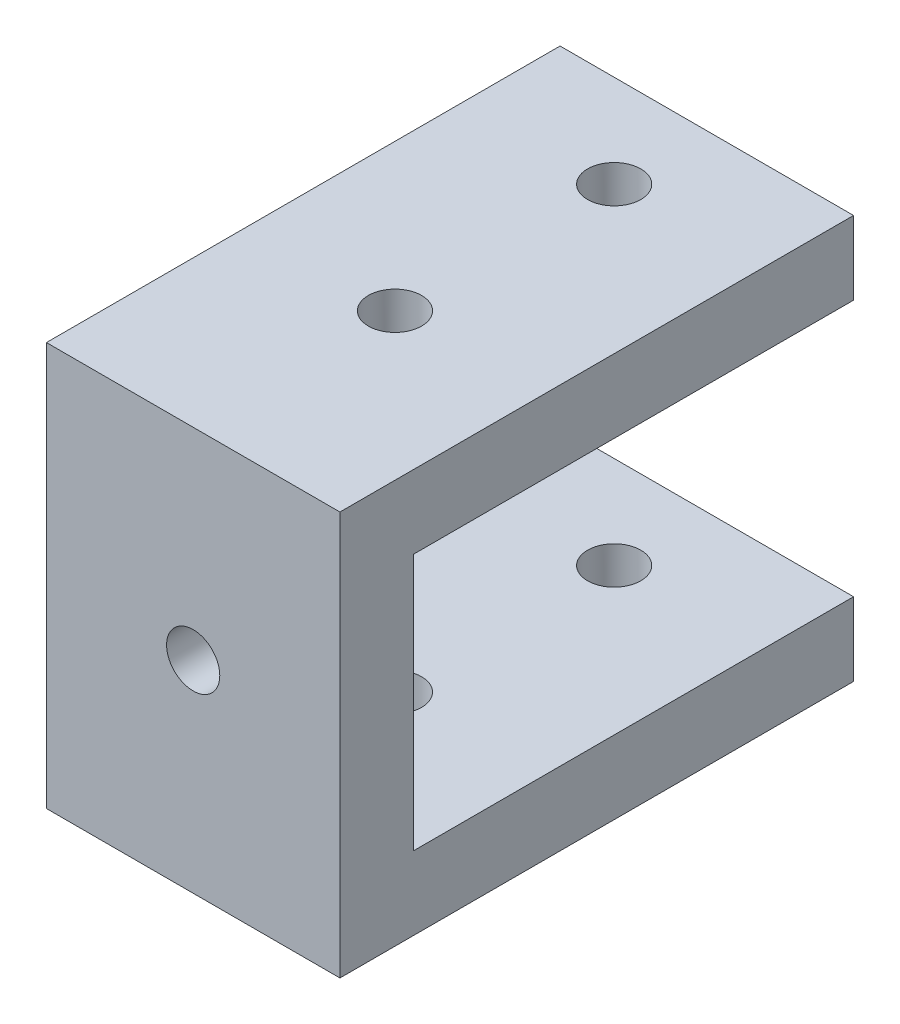
ISO-10303-21;
HEADER;
FILE_DESCRIPTION(('STEP AP214'),'2;1');
FILE_NAME('part.step','',(''),(''),'','','');
FILE_SCHEMA(('AUTOMOTIVE_DESIGN { 1 0 10303 214 1 1 1 1 }'));
ENDSEC;
DATA;
#1=APPLICATION_CONTEXT('core data for automotive mechanical design processes');
#2=APPLICATION_PROTOCOL_DEFINITION('international standard','automotive_design',2000,#1);
#3=PRODUCT_CONTEXT('',#1,'mechanical');
#4=PRODUCT('Part','Part','',(#3));
#5=PRODUCT_RELATED_PRODUCT_CATEGORY('part','',(#4));
#6=PRODUCT_DEFINITION_FORMATION('','',#4);
#7=PRODUCT_DEFINITION_CONTEXT('part definition',#1,'design');
#8=PRODUCT_DEFINITION('design','',#6,#7);
#9=PRODUCT_DEFINITION_SHAPE('','',#8);
#10=(LENGTH_UNIT() NAMED_UNIT(*) SI_UNIT(.MILLI.,.METRE.));
#11=(NAMED_UNIT(*) PLANE_ANGLE_UNIT() SI_UNIT($,.RADIAN.));
#12=(NAMED_UNIT(*) SI_UNIT($,.STERADIAN.) SOLID_ANGLE_UNIT());
#13=UNCERTAINTY_MEASURE_WITH_UNIT(LENGTH_MEASURE(1.E-05),#10,'distance_accuracy_value','');
#14=(GEOMETRIC_REPRESENTATION_CONTEXT(3) GLOBAL_UNCERTAINTY_ASSIGNED_CONTEXT((#13)) GLOBAL_UNIT_ASSIGNED_CONTEXT((#10,
#11,#12)) REPRESENTATION_CONTEXT('',''));
#15=CARTESIAN_POINT('',(0.,0.,0.));
#16=DIRECTION('',(0.,0.,1.));
#17=DIRECTION('',(1.,0.,0.));
#18=AXIS2_PLACEMENT_3D('',#15,#16,#17);
#19=CARTESIAN_POINT('',(20.32,8.89000000000001,-30.48));
#20=DIRECTION('',(0.,1.,0.));
#21=DIRECTION('',(0.,0.,1.));
#22=AXIS2_PLACEMENT_3D('',#19,#20,#21);
#23=PLANE('',#22);
#24=CARTESIAN_POINT('',(10.16,8.89000000000001,-8.89));
#25=DIRECTION('',(0.,1.,0.));
#26=DIRECTION('',(0.,0.,1.));
#27=AXIS2_PLACEMENT_3D('',#24,#25,#26);
#28=CIRCLE('',#27,1.8415);
#29=CARTESIAN_POINT('',(10.16,8.89,-7.04849999999999));
#30=VERTEX_POINT('',#29);
#31=EDGE_CURVE('E214',#30,#30,#28,.T.);
#32=ORIENTED_EDGE('',*,*,#31,.T.);
#33=EDGE_LOOP('',(#32));
#34=FACE_BOUND('',#33,.T.);
#35=CARTESIAN_POINT('',(10.16,8.89000000000001,-24.0665));
#36=DIRECTION('',(0.,1.,0.));
#37=DIRECTION('',(0.,0.,1.));
#38=AXIS2_PLACEMENT_3D('',#35,#36,#37);
#39=CIRCLE('',#38,1.8415);
#40=CARTESIAN_POINT('',(10.16,8.89000000000001,-22.225));
#41=VERTEX_POINT('',#40);
#42=EDGE_CURVE('E196',#41,#41,#39,.T.);
#43=ORIENTED_EDGE('',*,*,#42,.T.);
#44=EDGE_LOOP('',(#43));
#45=FACE_BOUND('',#44,.T.);
#46=DIRECTION('',(0.,0.,-1.));
#47=VECTOR('',#46,1.);
#48=CARTESIAN_POINT('',(0.,8.89000000000001,-30.48));
#49=LINE('',#48,#47);
#50=CARTESIAN_POINT('',(0.,8.89,0.));
#51=VERTEX_POINT('',#50);
#52=CARTESIAN_POINT('',(0.,8.89000000000001,-30.48));
#53=VERTEX_POINT('',#52);
#54=EDGE_CURVE('E146',#51,#53,#49,.T.);
#55=ORIENTED_EDGE('',*,*,#54,.T.);
#56=DIRECTION('',(-1.,0.,0.));
#57=VECTOR('',#56,1.);
#58=CARTESIAN_POINT('',(20.32,8.89000000000001,-30.48));
#59=LINE('',#58,#57);
#60=CARTESIAN_POINT('',(20.32,8.89000000000001,-30.48));
#61=VERTEX_POINT('',#60);
#62=EDGE_CURVE('E11',#61,#53,#59,.T.);
#63=ORIENTED_EDGE('',*,*,#62,.F.);
#64=DIRECTION('',(0.,0.,-1.));
#65=VECTOR('',#64,1.);
#66=CARTESIAN_POINT('',(20.32,8.89000000000001,-30.48));
#67=LINE('',#66,#65);
#68=CARTESIAN_POINT('',(20.32,8.89,0.));
#69=VERTEX_POINT('',#68);
#70=EDGE_CURVE('E169',#69,#61,#67,.T.);
#71=ORIENTED_EDGE('',*,*,#70,.F.);
#72=DIRECTION('',(-1.,0.,0.));
#73=VECTOR('',#72,1.);
#74=CARTESIAN_POINT('',(20.32,8.89,0.));
#75=LINE('',#74,#73);
#76=EDGE_CURVE('E142',#69,#51,#75,.T.);
#77=ORIENTED_EDGE('',*,*,#76,.T.);
#78=EDGE_LOOP('',(#55,#63,#71,#77));
#79=FACE_BOUND('',#78,.T.);
#80=ADVANCED_FACE('F43',(#34,#45,#79),#23,.F.);
#81=CARTESIAN_POINT('',(20.32,13.97,-30.48));
#82=DIRECTION('',(0.,0.,1.));
#83=DIRECTION('',(1.,0.,0.));
#84=AXIS2_PLACEMENT_3D('',#81,#82,#83);
#85=PLANE('',#84);
#86=DIRECTION('',(0.,1.,0.));
#87=VECTOR('',#86,1.);
#88=CARTESIAN_POINT('',(0.,13.97,-30.48));
#89=LINE('',#88,#87);
#90=CARTESIAN_POINT('',(0.,13.97,-30.48));
#91=VERTEX_POINT('',#90);
#92=EDGE_CURVE('E150',#53,#91,#89,.T.);
#93=ORIENTED_EDGE('',*,*,#92,.T.);
#94=DIRECTION('',(-1.,0.,0.));
#95=VECTOR('',#94,1.);
#96=CARTESIAN_POINT('',(20.32,13.97,-30.48));
#97=LINE('',#96,#95);
#98=CARTESIAN_POINT('',(20.32,13.97,-30.48));
#99=VERTEX_POINT('',#98);
#100=EDGE_CURVE('E53',#99,#91,#97,.T.);
#101=ORIENTED_EDGE('',*,*,#100,.F.);
#102=DIRECTION('',(0.,1.,0.));
#103=VECTOR('',#102,1.);
#104=CARTESIAN_POINT('',(20.32,13.97,-30.48));
#105=LINE('',#104,#103);
#106=EDGE_CURVE('E105',#61,#99,#105,.T.);
#107=ORIENTED_EDGE('',*,*,#106,.F.);
#108=ORIENTED_EDGE('',*,*,#62,.T.);
#109=EDGE_LOOP('',(#93,#101,#107,#108));
#110=FACE_BOUND('',#109,.T.);
#111=ADVANCED_FACE('F258',(#110),#85,.F.);
#112=CARTESIAN_POINT('',(20.32,13.97,5.08000000000001));
#113=DIRECTION('',(0.,-1.,0.));
#114=DIRECTION('',(0.,0.,-1.));
#115=AXIS2_PLACEMENT_3D('',#112,#113,#114);
#116=PLANE('',#115);
#117=CARTESIAN_POINT('',(10.16,13.97,-8.89));
#118=DIRECTION('',(0.,-1.,0.));
#119=DIRECTION('',(0.,0.,-1.));
#120=AXIS2_PLACEMENT_3D('',#117,#118,#119);
#121=CIRCLE('',#120,1.8415);
#122=CARTESIAN_POINT('',(10.16,13.97,-10.7315));
#123=VERTEX_POINT('',#122);
#124=EDGE_CURVE('E210',#123,#123,#121,.T.);
#125=ORIENTED_EDGE('',*,*,#124,.T.);
#126=EDGE_LOOP('',(#125));
#127=FACE_BOUND('',#126,.T.);
#128=CARTESIAN_POINT('',(10.16,13.97,-24.0665));
#129=DIRECTION('',(0.,-1.,0.));
#130=DIRECTION('',(0.,0.,-1.));
#131=AXIS2_PLACEMENT_3D('',#128,#129,#130);
#132=CIRCLE('',#131,1.8415);
#133=CARTESIAN_POINT('',(10.16,13.97,-25.908));
#134=VERTEX_POINT('',#133);
#135=EDGE_CURVE('E189',#134,#134,#132,.T.);
#136=ORIENTED_EDGE('',*,*,#135,.T.);
#137=EDGE_LOOP('',(#136));
#138=FACE_BOUND('',#137,.T.);
#139=DIRECTION('',(0.,0.,1.));
#140=VECTOR('',#139,1.);
#141=CARTESIAN_POINT('',(0.,13.97,5.08000000000001));
#142=LINE('',#141,#140);
#143=CARTESIAN_POINT('',(0.,13.97,5.08000000000001));
#144=VERTEX_POINT('',#143);
#145=EDGE_CURVE('E154',#91,#144,#142,.T.);
#146=ORIENTED_EDGE('',*,*,#145,.T.);
#147=DIRECTION('',(-1.,0.,0.));
#148=VECTOR('',#147,1.);
#149=CARTESIAN_POINT('',(20.32,13.97,5.08000000000001));
#150=LINE('',#149,#148);
#151=CARTESIAN_POINT('',(20.32,13.97,5.08000000000001));
#152=VERTEX_POINT('',#151);
#153=EDGE_CURVE('E180',#152,#144,#150,.T.);
#154=ORIENTED_EDGE('',*,*,#153,.F.);
#155=DIRECTION('',(0.,0.,1.));
#156=VECTOR('',#155,1.);
#157=CARTESIAN_POINT('',(20.32,13.97,5.08000000000001));
#158=LINE('',#157,#156);
#159=EDGE_CURVE('E229',#99,#152,#158,.T.);
#160=ORIENTED_EDGE('',*,*,#159,.F.);
#161=ORIENTED_EDGE('',*,*,#100,.T.);
#162=EDGE_LOOP('',(#146,#154,#160,#161));
#163=FACE_BOUND('',#162,.T.);
#164=ADVANCED_FACE('F263',(#127,#138,#163),#116,.F.);
#165=CARTESIAN_POINT('',(20.32,-13.97,5.08));
#166=DIRECTION('',(0.,0.,-1.));
#167=DIRECTION('',(0.,1.,0.));
#168=AXIS2_PLACEMENT_3D('',#165,#166,#167);
#169=PLANE('',#168);
#170=CARTESIAN_POINT('',(10.16,0.,5.08));
#171=DIRECTION('',(0.,0.,1.));
#172=DIRECTION('',(1.,0.,0.));
#173=AXIS2_PLACEMENT_3D('',#170,#171,#172);
#174=CIRCLE('',#173,1.8415);
#175=CARTESIAN_POINT('',(12.0015,0.,5.08));
#176=VERTEX_POINT('',#175);
#177=EDGE_CURVE('E218',#176,#176,#174,.T.);
#178=ORIENTED_EDGE('',*,*,#177,.F.);
#179=EDGE_LOOP('',(#178));
#180=FACE_BOUND('',#179,.T.);
#181=DIRECTION('',(0.,-1.,0.));
#182=VECTOR('',#181,1.);
#183=CARTESIAN_POINT('',(0.,-13.97,5.08));
#184=LINE('',#183,#182);
#185=CARTESIAN_POINT('',(0.,-13.97,5.08));
#186=VERTEX_POINT('',#185);
#187=EDGE_CURVE('E157',#144,#186,#184,.T.);
#188=ORIENTED_EDGE('',*,*,#187,.T.);
#189=DIRECTION('',(-1.,0.,0.));
#190=VECTOR('',#189,1.);
#191=CARTESIAN_POINT('',(20.32,-13.97,5.08));
#192=LINE('',#191,#190);
#193=CARTESIAN_POINT('',(20.32,-13.97,5.08));
#194=VERTEX_POINT('',#193);
#195=EDGE_CURVE('E176',#194,#186,#192,.T.);
#196=ORIENTED_EDGE('',*,*,#195,.F.);
#197=DIRECTION('',(0.,-1.,0.));
#198=VECTOR('',#197,1.);
#199=CARTESIAN_POINT('',(20.32,-13.97,5.08));
#200=LINE('',#199,#198);
#201=EDGE_CURVE('E232',#152,#194,#200,.T.);
#202=ORIENTED_EDGE('',*,*,#201,.F.);
#203=ORIENTED_EDGE('',*,*,#153,.T.);
#204=EDGE_LOOP('',(#188,#196,#202,#203));
#205=FACE_BOUND('',#204,.T.);
#206=ADVANCED_FACE('F281',(#180,#205),#169,.F.);
#207=CARTESIAN_POINT('',(20.32,-13.97,-30.48));
#208=DIRECTION('',(0.,1.,0.));
#209=DIRECTION('',(0.,0.,1.));
#210=AXIS2_PLACEMENT_3D('',#207,#208,#209);
#211=PLANE('',#210);
#212=CARTESIAN_POINT('',(10.16,-13.97,-8.89));
#213=DIRECTION('',(0.,1.,0.));
#214=DIRECTION('',(0.,0.,1.));
#215=AXIS2_PLACEMENT_3D('',#212,#213,#214);
#216=CIRCLE('',#215,1.8415);
#217=CARTESIAN_POINT('',(10.16,-13.97,-7.04849999999999));
#218=VERTEX_POINT('',#217);
#219=EDGE_CURVE('E190',#218,#218,#216,.T.);
#220=ORIENTED_EDGE('',*,*,#219,.T.);
#221=EDGE_LOOP('',(#220));
#222=FACE_BOUND('',#221,.T.);
#223=CARTESIAN_POINT('',(10.16,-13.97,-24.0665));
#224=DIRECTION('',(0.,1.,0.));
#225=DIRECTION('',(0.,0.,1.));
#226=AXIS2_PLACEMENT_3D('',#223,#224,#225);
#227=CIRCLE('',#226,1.8415);
#228=CARTESIAN_POINT('',(10.16,-13.97,-22.225));
#229=VERTEX_POINT('',#228);
#230=EDGE_CURVE('E199',#229,#229,#227,.T.);
#231=ORIENTED_EDGE('',*,*,#230,.T.);
#232=EDGE_LOOP('',(#231));
#233=FACE_BOUND('',#232,.T.);
#234=DIRECTION('',(0.,0.,-1.));
#235=VECTOR('',#234,1.);
#236=CARTESIAN_POINT('',(0.,-13.97,-30.48));
#237=LINE('',#236,#235);
#238=CARTESIAN_POINT('',(0.,-13.97,-30.48));
#239=VERTEX_POINT('',#238);
#240=EDGE_CURVE('E160',#186,#239,#237,.T.);
#241=ORIENTED_EDGE('',*,*,#240,.T.);
#242=DIRECTION('',(-1.,0.,0.));
#243=VECTOR('',#242,1.);
#244=CARTESIAN_POINT('',(20.32,-13.97,-30.48));
#245=LINE('',#244,#243);
#246=CARTESIAN_POINT('',(20.32,-13.97,-30.48));
#247=VERTEX_POINT('',#246);
#248=EDGE_CURVE('E135',#247,#239,#245,.T.);
#249=ORIENTED_EDGE('',*,*,#248,.F.);
#250=DIRECTION('',(0.,0.,-1.));
#251=VECTOR('',#250,1.);
#252=CARTESIAN_POINT('',(20.32,-13.97,-30.48));
#253=LINE('',#252,#251);
#254=EDGE_CURVE('E124',#194,#247,#253,.T.);
#255=ORIENTED_EDGE('',*,*,#254,.F.);
#256=ORIENTED_EDGE('',*,*,#195,.T.);
#257=EDGE_LOOP('',(#241,#249,#255,#256));
#258=FACE_BOUND('',#257,.T.);
#259=ADVANCED_FACE('F284',(#222,#233,#258),#211,.F.);
#260=CARTESIAN_POINT('',(20.32,-8.89,-30.48));
#261=DIRECTION('',(0.,0.,1.));
#262=DIRECTION('',(1.,0.,0.));
#263=AXIS2_PLACEMENT_3D('',#260,#261,#262);
#264=PLANE('',#263);
#265=DIRECTION('',(0.,1.,0.));
#266=VECTOR('',#265,1.);
#267=CARTESIAN_POINT('',(0.,-8.89,-30.48));
#268=LINE('',#267,#266);
#269=CARTESIAN_POINT('',(0.,-8.89,-30.48));
#270=VERTEX_POINT('',#269);
#271=EDGE_CURVE('E133',#239,#270,#268,.T.);
#272=ORIENTED_EDGE('',*,*,#271,.T.);
#273=DIRECTION('',(-1.,0.,0.));
#274=VECTOR('',#273,1.);
#275=CARTESIAN_POINT('',(20.32,-8.89,-30.48));
#276=LINE('',#275,#274);
#277=CARTESIAN_POINT('',(20.32,-8.89,-30.48));
#278=VERTEX_POINT('',#277);
#279=EDGE_CURVE('E130',#278,#270,#276,.T.);
#280=ORIENTED_EDGE('',*,*,#279,.F.);
#281=DIRECTION('',(0.,1.,0.));
#282=VECTOR('',#281,1.);
#283=CARTESIAN_POINT('',(20.32,-8.89,-30.48));
#284=LINE('',#283,#282);
#285=EDGE_CURVE('E118',#247,#278,#284,.T.);
#286=ORIENTED_EDGE('',*,*,#285,.F.);
#287=ORIENTED_EDGE('',*,*,#248,.T.);
#288=EDGE_LOOP('',(#272,#280,#286,#287));
#289=FACE_BOUND('',#288,.T.);
#290=ADVANCED_FACE('F131',(#289),#264,.F.);
#291=CARTESIAN_POINT('',(20.32,-8.89,0.));
#292=DIRECTION('',(0.,-1.,0.));
#293=DIRECTION('',(0.,0.,-1.));
#294=AXIS2_PLACEMENT_3D('',#291,#292,#293);
#295=PLANE('',#294);
#296=CARTESIAN_POINT('',(10.16,-8.89,-8.89));
#297=DIRECTION('',(0.,-1.,0.));
#298=DIRECTION('',(0.,0.,-1.));
#299=AXIS2_PLACEMENT_3D('',#296,#297,#298);
#300=CIRCLE('',#299,1.8415);
#301=CARTESIAN_POINT('',(10.16,-8.89,-10.7315));
#302=VERTEX_POINT('',#301);
#303=EDGE_CURVE('E46',#302,#302,#300,.T.);
#304=ORIENTED_EDGE('',*,*,#303,.T.);
#305=EDGE_LOOP('',(#304));
#306=FACE_BOUND('',#305,.T.);
#307=CARTESIAN_POINT('',(10.16,-8.89,-24.0665));
#308=DIRECTION('',(0.,-1.,0.));
#309=DIRECTION('',(0.,0.,-1.));
#310=AXIS2_PLACEMENT_3D('',#307,#308,#309);
#311=CIRCLE('',#310,1.8415);
#312=CARTESIAN_POINT('',(10.16,-8.89,-25.908));
#313=VERTEX_POINT('',#312);
#314=EDGE_CURVE('E186',#313,#313,#311,.T.);
#315=ORIENTED_EDGE('',*,*,#314,.T.);
#316=EDGE_LOOP('',(#315));
#317=FACE_BOUND('',#316,.T.);
#318=DIRECTION('',(0.,0.,1.));
#319=VECTOR('',#318,1.);
#320=CARTESIAN_POINT('',(0.,-8.89,0.));
#321=LINE('',#320,#319);
#322=CARTESIAN_POINT('',(0.,-8.89,0.));
#323=VERTEX_POINT('',#322);
#324=EDGE_CURVE('E91',#270,#323,#321,.T.);
#325=ORIENTED_EDGE('',*,*,#324,.T.);
#326=DIRECTION('',(-1.,0.,0.));
#327=VECTOR('',#326,1.);
#328=CARTESIAN_POINT('',(20.32,-8.89,0.));
#329=LINE('',#328,#327);
#330=CARTESIAN_POINT('',(20.32,-8.89,0.));
#331=VERTEX_POINT('',#330);
#332=EDGE_CURVE('E136',#331,#323,#329,.T.);
#333=ORIENTED_EDGE('',*,*,#332,.F.);
#334=DIRECTION('',(0.,0.,1.));
#335=VECTOR('',#334,1.);
#336=CARTESIAN_POINT('',(20.32,-8.89,0.));
#337=LINE('',#336,#335);
#338=EDGE_CURVE('E122',#278,#331,#337,.T.);
#339=ORIENTED_EDGE('',*,*,#338,.F.);
#340=ORIENTED_EDGE('',*,*,#279,.T.);
#341=EDGE_LOOP('',(#325,#333,#339,#340));
#342=FACE_BOUND('',#341,.T.);
#343=ADVANCED_FACE('F138',(#306,#317,#342),#295,.F.);
#344=CARTESIAN_POINT('',(20.32,8.89,0.));
#345=DIRECTION('',(0.,0.,1.));
#346=DIRECTION('',(0.,-1.,0.));
#347=AXIS2_PLACEMENT_3D('',#344,#345,#346);
#348=PLANE('',#347);
#349=CARTESIAN_POINT('',(10.16,0.,0.));
#350=DIRECTION('',(0.,0.,1.));
#351=DIRECTION('',(0.,-1.,0.));
#352=AXIS2_PLACEMENT_3D('',#349,#350,#351);
#353=CIRCLE('',#352,1.8415);
#354=CARTESIAN_POINT('',(10.16,-1.8415,0.));
#355=VERTEX_POINT('',#354);
#356=EDGE_CURVE('E151',#355,#355,#353,.F.);
#357=ORIENTED_EDGE('',*,*,#356,.F.);
#358=EDGE_LOOP('',(#357));
#359=FACE_BOUND('',#358,.T.);
#360=DIRECTION('',(0.,1.,0.));
#361=VECTOR('',#360,1.);
#362=CARTESIAN_POINT('',(0.,8.89,0.));
#363=LINE('',#362,#361);
#364=EDGE_CURVE('E97',#323,#51,#363,.T.);
#365=ORIENTED_EDGE('',*,*,#364,.T.);
#366=ORIENTED_EDGE('',*,*,#76,.F.);
#367=DIRECTION('',(0.,1.,0.));
#368=VECTOR('',#367,1.);
#369=CARTESIAN_POINT('',(20.32,8.89,0.));
#370=LINE('',#369,#368);
#371=EDGE_CURVE('E62',#331,#69,#370,.T.);
#372=ORIENTED_EDGE('',*,*,#371,.F.);
#373=ORIENTED_EDGE('',*,*,#332,.T.);
#374=EDGE_LOOP('',(#365,#366,#372,#373));
#375=FACE_BOUND('',#374,.T.);
#376=ADVANCED_FACE('F324',(#359,#375),#348,.F.);
#377=CARTESIAN_POINT('',(20.32,0.,0.));
#378=DIRECTION('',(1.,0.,0.));
#379=DIRECTION('',(0.,0.,-1.));
#380=AXIS2_PLACEMENT_3D('',#377,#378,#379);
#381=PLANE('',#380);
#382=ORIENTED_EDGE('',*,*,#70,.T.);
#383=ORIENTED_EDGE('',*,*,#106,.T.);
#384=ORIENTED_EDGE('',*,*,#159,.T.);
#385=ORIENTED_EDGE('',*,*,#201,.T.);
#386=ORIENTED_EDGE('',*,*,#254,.T.);
#387=ORIENTED_EDGE('',*,*,#285,.T.);
#388=ORIENTED_EDGE('',*,*,#338,.T.);
#389=ORIENTED_EDGE('',*,*,#371,.T.);
#390=EDGE_LOOP('',(#382,#383,#384,#385,#386,#387,#388,#389));
#391=FACE_BOUND('',#390,.T.);
#392=ADVANCED_FACE('F120',(#391),#381,.T.);
#393=CARTESIAN_POINT('',(0.,0.,0.));
#394=DIRECTION('',(1.,0.,0.));
#395=DIRECTION('',(0.,0.,-1.));
#396=AXIS2_PLACEMENT_3D('',#393,#394,#395);
#397=PLANE('',#396);
#398=ORIENTED_EDGE('',*,*,#54,.F.);
#399=ORIENTED_EDGE('',*,*,#364,.F.);
#400=ORIENTED_EDGE('',*,*,#324,.F.);
#401=ORIENTED_EDGE('',*,*,#271,.F.);
#402=ORIENTED_EDGE('',*,*,#240,.F.);
#403=ORIENTED_EDGE('',*,*,#187,.F.);
#404=ORIENTED_EDGE('',*,*,#145,.F.);
#405=ORIENTED_EDGE('',*,*,#92,.F.);
#406=EDGE_LOOP('',(#398,#399,#400,#401,#402,#403,#404,#405));
#407=FACE_BOUND('',#406,.T.);
#408=ADVANCED_FACE('F272',(#407),#397,.F.);
#409=CARTESIAN_POINT('',(10.16,0.,-30.481));
#410=DIRECTION('',(0.,0.,1.));
#411=DIRECTION('',(1.,0.,0.));
#412=AXIS2_PLACEMENT_3D('',#409,#410,#411);
#413=CYLINDRICAL_SURFACE('',#412,1.8415);
#414=ORIENTED_EDGE('',*,*,#177,.T.);
#415=EDGE_LOOP('',(#414));
#416=FACE_BOUND('',#415,.T.);
#417=ORIENTED_EDGE('',*,*,#356,.T.);
#418=EDGE_LOOP('',(#417));
#419=FACE_BOUND('',#418,.T.);
#420=ADVANCED_FACE('F253',(#416,#419),#413,.F.);
#421=CARTESIAN_POINT('',(10.16,-13.97,-24.0665));
#422=DIRECTION('',(0.,1.,0.));
#423=DIRECTION('',(0.,0.,1.));
#424=AXIS2_PLACEMENT_3D('',#421,#422,#423);
#425=CYLINDRICAL_SURFACE('',#424,1.8415);
#426=ORIENTED_EDGE('',*,*,#230,.F.);
#427=EDGE_LOOP('',(#426));
#428=FACE_BOUND('',#427,.T.);
#429=ORIENTED_EDGE('',*,*,#314,.F.);
#430=EDGE_LOOP('',(#429));
#431=FACE_BOUND('',#430,.T.);
#432=ADVANCED_FACE('F243',(#428,#431),#425,.F.);
#433=CARTESIAN_POINT('',(10.16,-13.97,-8.89));
#434=DIRECTION('',(0.,1.,0.));
#435=DIRECTION('',(0.,0.,1.));
#436=AXIS2_PLACEMENT_3D('',#433,#434,#435);
#437=CYLINDRICAL_SURFACE('',#436,1.8415);
#438=ORIENTED_EDGE('',*,*,#219,.F.);
#439=EDGE_LOOP('',(#438));
#440=FACE_BOUND('',#439,.T.);
#441=ORIENTED_EDGE('',*,*,#303,.F.);
#442=EDGE_LOOP('',(#441));
#443=FACE_BOUND('',#442,.T.);
#444=ADVANCED_FACE('F240',(#440,#443),#437,.F.);
#445=ORIENTED_EDGE('',*,*,#135,.F.);
#446=EDGE_LOOP('',(#445));
#447=FACE_BOUND('',#446,.T.);
#448=ORIENTED_EDGE('',*,*,#42,.F.);
#449=EDGE_LOOP('',(#448));
#450=FACE_BOUND('',#449,.T.);
#451=ADVANCED_FACE('F242',(#447,#450),#425,.F.);
#452=ORIENTED_EDGE('',*,*,#124,.F.);
#453=EDGE_LOOP('',(#452));
#454=FACE_BOUND('',#453,.T.);
#455=ORIENTED_EDGE('',*,*,#31,.F.);
#456=EDGE_LOOP('',(#455));
#457=FACE_BOUND('',#456,.T.);
#458=ADVANCED_FACE('F246',(#454,#457),#437,.F.);
#459=CLOSED_SHELL('',(#80,#111,#164,#206,#259,#290,#343,#376,#392,#408,#420,#432,#444,#451,#458));
#460=MANIFOLD_SOLID_BREP('B2',#459);
#461=ADVANCED_BREP_SHAPE_REPRESENTATION('',(#18,#460),#14);
#462=SHAPE_DEFINITION_REPRESENTATION(#9,#461);
ENDSEC;
END-ISO-10303-21;
